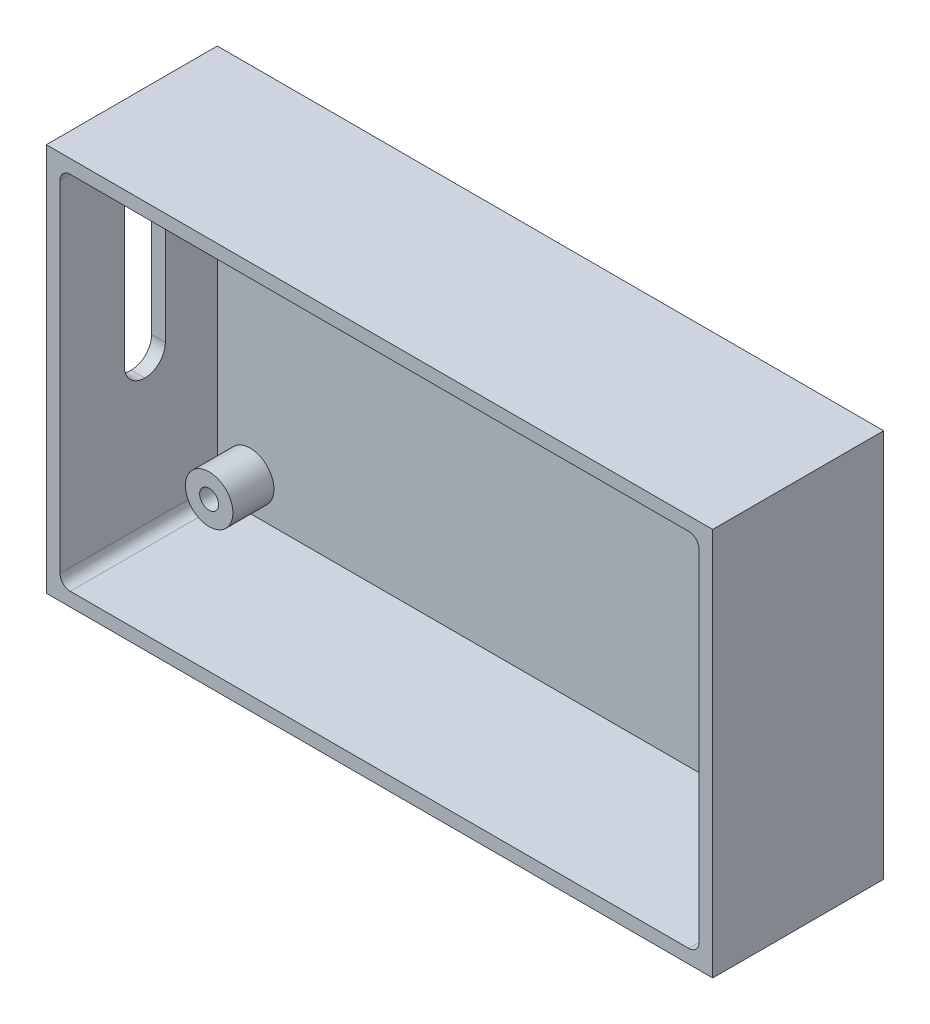
ISO-10303-21;
HEADER;
FILE_DESCRIPTION(('STEP AP214'),'2;1');
FILE_NAME('part.step','',(''),(''),'','','');
FILE_SCHEMA(('AUTOMOTIVE_DESIGN { 1 0 10303 214 1 1 1 1 }'));
ENDSEC;
DATA;
#1=APPLICATION_CONTEXT('core data for automotive mechanical design processes');
#2=APPLICATION_PROTOCOL_DEFINITION('international standard','automotive_design',2000,#1);
#3=PRODUCT_CONTEXT('',#1,'mechanical');
#4=PRODUCT('Part','Part','',(#3));
#5=PRODUCT_RELATED_PRODUCT_CATEGORY('part','',(#4));
#6=PRODUCT_DEFINITION_FORMATION('','',#4);
#7=PRODUCT_DEFINITION_CONTEXT('part definition',#1,'design');
#8=PRODUCT_DEFINITION('design','',#6,#7);
#9=PRODUCT_DEFINITION_SHAPE('','',#8);
#10=(LENGTH_UNIT() NAMED_UNIT(*) SI_UNIT(.MILLI.,.METRE.));
#11=(NAMED_UNIT(*) PLANE_ANGLE_UNIT() SI_UNIT($,.RADIAN.));
#12=(NAMED_UNIT(*) SI_UNIT($,.STERADIAN.) SOLID_ANGLE_UNIT());
#13=UNCERTAINTY_MEASURE_WITH_UNIT(LENGTH_MEASURE(1.E-05),#10,'distance_accuracy_value','');
#14=(GEOMETRIC_REPRESENTATION_CONTEXT(3) GLOBAL_UNCERTAINTY_ASSIGNED_CONTEXT((#13)) GLOBAL_UNIT_ASSIGNED_CONTEXT((#10,
#11,#12)) REPRESENTATION_CONTEXT('',''));
#15=CARTESIAN_POINT('',(0.,0.,0.));
#16=DIRECTION('',(0.,0.,1.));
#17=DIRECTION('',(1.,0.,0.));
#18=AXIS2_PLACEMENT_3D('',#15,#16,#17);
#19=CARTESIAN_POINT('',(3.81,3.81,0.));
#20=DIRECTION('',(0.,0.,-1.));
#21=DIRECTION('',(-1.,0.,0.));
#22=AXIS2_PLACEMENT_3D('',#19,#20,#21);
#23=PLANE('',#22);
#24=CARTESIAN_POINT('',(3.81,3.81,0.));
#25=DIRECTION('',(0.,0.,-1.));
#26=DIRECTION('',(-1.,0.,0.));
#27=AXIS2_PLACEMENT_3D('',#24,#25,#26);
#28=CIRCLE('',#27,3.47265625);
#29=CARTESIAN_POINT('',(0.33734375,3.81,0.));
#30=VERTEX_POINT('',#29);
#31=EDGE_CURVE('E249',#30,#30,#28,.T.);
#32=ORIENTED_EDGE('',*,*,#31,.F.);
#33=EDGE_LOOP('',(#32));
#34=FACE_BOUND('',#33,.T.);
#35=CARTESIAN_POINT('',(3.81,3.81,0.));
#36=DIRECTION('',(0.,0.,-1.));
#37=DIRECTION('',(-1.,0.,0.));
#38=AXIS2_PLACEMENT_3D('',#35,#36,#37);
#39=CIRCLE('',#38,1.3890625);
#40=CARTESIAN_POINT('',(2.4209375,3.81,0.));
#41=VERTEX_POINT('',#40);
#42=EDGE_CURVE('E245',#41,#41,#39,.T.);
#43=ORIENTED_EDGE('',*,*,#42,.T.);
#44=EDGE_LOOP('',(#43));
#45=FACE_BOUND('',#44,.T.);
#46=ADVANCED_FACE('F36',(#34,#45),#23,.F.);
#47=CARTESIAN_POINT('',(3.81,3.81,-6.));
#48=DIRECTION('',(0.,0.,1.));
#49=DIRECTION('',(1.,0.,0.));
#50=AXIS2_PLACEMENT_3D('',#47,#48,#49);
#51=CYLINDRICAL_SURFACE('',#50,3.47265625);
#52=CARTESIAN_POINT('',(3.81,3.81,-6.));
#53=DIRECTION('',(0.,0.,-1.));
#54=DIRECTION('',(-1.,0.,0.));
#55=AXIS2_PLACEMENT_3D('',#52,#53,#54);
#56=CIRCLE('',#55,3.47265625);
#57=CARTESIAN_POINT('',(0.33734375,3.81,-6.));
#58=VERTEX_POINT('',#57);
#59=EDGE_CURVE('E250',#58,#58,#56,.T.);
#60=ORIENTED_EDGE('',*,*,#59,.F.);
#61=EDGE_LOOP('',(#60));
#62=FACE_BOUND('',#61,.T.);
#63=ORIENTED_EDGE('',*,*,#31,.T.);
#64=EDGE_LOOP('',(#63));
#65=FACE_BOUND('',#64,.T.);
#66=ADVANCED_FACE('F443',(#62,#65),#51,.T.);
#67=CARTESIAN_POINT('',(3.81,3.81,-6.));
#68=DIRECTION('',(0.,0.,1.));
#69=DIRECTION('',(1.,0.,0.));
#70=AXIS2_PLACEMENT_3D('',#67,#68,#69);
#71=CYLINDRICAL_SURFACE('',#70,1.3890625);
#72=ORIENTED_EDGE('',*,*,#42,.F.);
#73=EDGE_LOOP('',(#72));
#74=FACE_BOUND('',#73,.T.);
#75=CARTESIAN_POINT('',(3.81,3.81,-8.));
#76=DIRECTION('',(0.,0.,-1.));
#77=DIRECTION('',(-1.,0.,0.));
#78=AXIS2_PLACEMENT_3D('',#75,#76,#77);
#79=CIRCLE('',#78,1.3890625);
#80=CARTESIAN_POINT('',(2.4209375,3.81,-8.));
#81=VERTEX_POINT('',#80);
#82=EDGE_CURVE('E357',#81,#81,#79,.F.);
#83=ORIENTED_EDGE('',*,*,#82,.F.);
#84=EDGE_LOOP('',(#83));
#85=FACE_BOUND('',#84,.T.);
#86=ADVANCED_FACE('F449',(#74,#85),#71,.F.);
#87=CARTESIAN_POINT('',(0.,0.,-6.));
#88=DIRECTION('',(0.,0.,-1.));
#89=DIRECTION('',(-1.,0.,0.));
#90=AXIS2_PLACEMENT_3D('',#87,#88,#89);
#91=PLANE('',#90);
#92=CARTESIAN_POINT('',(87.63,46.99,-6.));
#93=DIRECTION('',(0.,0.,-1.));
#94=DIRECTION('',(-1.,0.,0.));
#95=AXIS2_PLACEMENT_3D('',#92,#93,#94);
#96=CIRCLE('',#95,3.47265624999999);
#97=CARTESIAN_POINT('',(84.15734375,46.99,-6.));
#98=VERTEX_POINT('',#97);
#99=EDGE_CURVE('E254',#98,#98,#96,.F.);
#100=ORIENTED_EDGE('',*,*,#99,.F.);
#101=EDGE_LOOP('',(#100));
#102=FACE_BOUND('',#101,.T.);
#103=ORIENTED_EDGE('',*,*,#59,.T.);
#104=EDGE_LOOP('',(#103));
#105=FACE_BOUND('',#104,.T.);
#106=DIRECTION('',(0.,1.,0.));
#107=VECTOR('',#106,1.);
#108=CARTESIAN_POINT('',(-1.,-1.,-6.));
#109=LINE('',#108,#107);
#110=CARTESIAN_POINT('',(-1.,0.5,-6.));
#111=VERTEX_POINT('',#110);
#112=CARTESIAN_POINT('',(-1.,50.3,-6.));
#113=VERTEX_POINT('',#112);
#114=EDGE_CURVE('E237',#111,#113,#109,.T.);
#115=ORIENTED_EDGE('',*,*,#114,.F.);
#116=CARTESIAN_POINT('',(0.5,0.5,-6.));
#117=DIRECTION('',(0.,0.,-1.));
#118=DIRECTION('',(-1.,0.,0.));
#119=AXIS2_PLACEMENT_3D('',#116,#117,#118);
#120=CIRCLE('',#119,1.5);
#121=CARTESIAN_POINT('',(0.5,-1.,-6.));
#122=VERTEX_POINT('',#121);
#123=EDGE_CURVE('E276',#111,#122,#120,.F.);
#124=ORIENTED_EDGE('',*,*,#123,.T.);
#125=DIRECTION('',(-1.,0.,0.));
#126=VECTOR('',#125,1.);
#127=CARTESIAN_POINT('',(-1.,-1.,-6.));
#128=LINE('',#127,#126);
#129=CARTESIAN_POINT('',(90.94,-1.,-6.));
#130=VERTEX_POINT('',#129);
#131=EDGE_CURVE('E233',#130,#122,#128,.T.);
#132=ORIENTED_EDGE('',*,*,#131,.F.);
#133=CARTESIAN_POINT('',(90.94,0.5,-6.));
#134=DIRECTION('',(0.,0.,-1.));
#135=DIRECTION('',(-1.,0.,0.));
#136=AXIS2_PLACEMENT_3D('',#133,#134,#135);
#137=CIRCLE('',#136,1.5);
#138=CARTESIAN_POINT('',(92.44,0.5,-6.));
#139=VERTEX_POINT('',#138);
#140=EDGE_CURVE('E274',#130,#139,#137,.F.);
#141=ORIENTED_EDGE('',*,*,#140,.T.);
#142=DIRECTION('',(0.,-1.,0.));
#143=VECTOR('',#142,1.);
#144=CARTESIAN_POINT('',(92.44,-1.,-6.));
#145=LINE('',#144,#143);
#146=CARTESIAN_POINT('',(92.44,50.3,-6.));
#147=VERTEX_POINT('',#146);
#148=EDGE_CURVE('E229',#147,#139,#145,.T.);
#149=ORIENTED_EDGE('',*,*,#148,.F.);
#150=CARTESIAN_POINT('',(90.94,50.3,-6.));
#151=DIRECTION('',(0.,0.,-1.));
#152=DIRECTION('',(-1.,0.,0.));
#153=AXIS2_PLACEMENT_3D('',#150,#151,#152);
#154=CIRCLE('',#153,1.5);
#155=CARTESIAN_POINT('',(90.94,51.8,-6.));
#156=VERTEX_POINT('',#155);
#157=EDGE_CURVE('E271',#147,#156,#154,.F.);
#158=ORIENTED_EDGE('',*,*,#157,.T.);
#159=DIRECTION('',(1.,0.,0.));
#160=VECTOR('',#159,1.);
#161=CARTESIAN_POINT('',(-1.,51.8,-6.));
#162=LINE('',#161,#160);
#163=CARTESIAN_POINT('',(0.5,51.8,-6.));
#164=VERTEX_POINT('',#163);
#165=EDGE_CURVE('E241',#164,#156,#162,.T.);
#166=ORIENTED_EDGE('',*,*,#165,.F.);
#167=CARTESIAN_POINT('',(0.5,50.3,-6.));
#168=DIRECTION('',(0.,0.,-1.));
#169=DIRECTION('',(-1.,0.,0.));
#170=AXIS2_PLACEMENT_3D('',#167,#168,#169);
#171=CIRCLE('',#170,1.5);
#172=EDGE_CURVE('E268',#164,#113,#171,.F.);
#173=ORIENTED_EDGE('',*,*,#172,.T.);
#174=EDGE_LOOP('',(#115,#124,#132,#141,#149,#158,#166,#173));
#175=FACE_BOUND('',#174,.T.);
#176=ADVANCED_FACE('F410',(#102,#105,#175),#91,.F.);
#177=CARTESIAN_POINT('',(87.63,46.99,0.));
#178=DIRECTION('',(0.,0.,-1.));
#179=DIRECTION('',(-1.,0.,0.));
#180=AXIS2_PLACEMENT_3D('',#177,#178,#179);
#181=PLANE('',#180);
#182=CARTESIAN_POINT('',(87.63,46.99,0.));
#183=DIRECTION('',(0.,0.,-1.));
#184=DIRECTION('',(-1.,0.,0.));
#185=AXIS2_PLACEMENT_3D('',#182,#183,#184);
#186=CIRCLE('',#185,3.47265624999999);
#187=CARTESIAN_POINT('',(84.15734375,46.99,0.));
#188=VERTEX_POINT('',#187);
#189=EDGE_CURVE('E225',#188,#188,#186,.T.);
#190=ORIENTED_EDGE('',*,*,#189,.F.);
#191=EDGE_LOOP('',(#190));
#192=FACE_BOUND('',#191,.T.);
#193=CARTESIAN_POINT('',(87.63,46.99,0.));
#194=DIRECTION('',(0.,0.,-1.));
#195=DIRECTION('',(-1.,0.,0.));
#196=AXIS2_PLACEMENT_3D('',#193,#194,#195);
#197=CIRCLE('',#196,1.38906249999999);
#198=CARTESIAN_POINT('',(86.2409375,46.99,0.));
#199=VERTEX_POINT('',#198);
#200=EDGE_CURVE('E216',#199,#199,#197,.T.);
#201=ORIENTED_EDGE('',*,*,#200,.T.);
#202=EDGE_LOOP('',(#201));
#203=FACE_BOUND('',#202,.T.);
#204=ADVANCED_FACE('F513',(#192,#203),#181,.F.);
#205=CARTESIAN_POINT('',(87.63,46.99,-6.));
#206=DIRECTION('',(0.,0.,1.));
#207=DIRECTION('',(1.,0.,0.));
#208=AXIS2_PLACEMENT_3D('',#205,#206,#207);
#209=CYLINDRICAL_SURFACE('',#208,3.47265624999999);
#210=ORIENTED_EDGE('',*,*,#99,.T.);
#211=EDGE_LOOP('',(#210));
#212=FACE_BOUND('',#211,.T.);
#213=ORIENTED_EDGE('',*,*,#189,.T.);
#214=EDGE_LOOP('',(#213));
#215=FACE_BOUND('',#214,.T.);
#216=ADVANCED_FACE('F511',(#212,#215),#209,.T.);
#217=CARTESIAN_POINT('',(87.63,46.99,-6.));
#218=DIRECTION('',(0.,0.,1.));
#219=DIRECTION('',(1.,0.,0.));
#220=AXIS2_PLACEMENT_3D('',#217,#218,#219);
#221=CYLINDRICAL_SURFACE('',#220,1.38906249999999);
#222=ORIENTED_EDGE('',*,*,#200,.F.);
#223=EDGE_LOOP('',(#222));
#224=FACE_BOUND('',#223,.T.);
#225=CARTESIAN_POINT('',(87.63,46.99,-8.));
#226=DIRECTION('',(0.,0.,-1.));
#227=DIRECTION('',(-1.,0.,0.));
#228=AXIS2_PLACEMENT_3D('',#225,#226,#227);
#229=CIRCLE('',#228,1.38906249999999);
#230=CARTESIAN_POINT('',(86.2409375,46.99,-8.));
#231=VERTEX_POINT('',#230);
#232=EDGE_CURVE('E362',#231,#231,#229,.F.);
#233=ORIENTED_EDGE('',*,*,#232,.F.);
#234=EDGE_LOOP('',(#233));
#235=FACE_BOUND('',#234,.T.);
#236=ADVANCED_FACE('F439',(#224,#235),#221,.F.);
#237=CARTESIAN_POINT('',(-1.,-1.,17.));
#238=DIRECTION('',(-1.,0.,0.));
#239=DIRECTION('',(0.,0.,1.));
#240=AXIS2_PLACEMENT_3D('',#237,#238,#239);
#241=PLANE('',#240);
#242=DIRECTION('',(0.,-1.,0.));
#243=VECTOR('',#242,1.);
#244=CARTESIAN_POINT('',(-1.,19.05,7.6));
#245=LINE('',#244,#243);
#246=CARTESIAN_POINT('',(-1.,46.53,7.6));
#247=VERTEX_POINT('',#246);
#248=CARTESIAN_POINT('',(-1.,22.05,7.6));
#249=VERTEX_POINT('',#248);
#250=EDGE_CURVE('E375',#247,#249,#245,.T.);
#251=ORIENTED_EDGE('',*,*,#250,.F.);
#252=CARTESIAN_POINT('',(-1.,46.53,4.6));
#253=DIRECTION('',(-1.,0.,0.));
#254=DIRECTION('',(0.,0.,1.));
#255=AXIS2_PLACEMENT_3D('',#252,#253,#254);
#256=CIRCLE('',#255,3.);
#257=CARTESIAN_POINT('',(-1.,49.53,4.6));
#258=VERTEX_POINT('',#257);
#259=EDGE_CURVE('E11',#247,#258,#256,.T.);
#260=ORIENTED_EDGE('',*,*,#259,.T.);
#261=CARTESIAN_POINT('',(-1.,46.53,4.6));
#262=DIRECTION('',(-1.,0.,0.));
#263=DIRECTION('',(0.,0.,1.));
#264=AXIS2_PLACEMENT_3D('',#261,#262,#263);
#265=CIRCLE('',#264,3.);
#266=CARTESIAN_POINT('',(-1.,46.53,1.6));
#267=VERTEX_POINT('',#266);
#268=EDGE_CURVE('E340',#258,#267,#265,.T.);
#269=ORIENTED_EDGE('',*,*,#268,.T.);
#270=DIRECTION('',(0.,1.,0.));
#271=VECTOR('',#270,1.);
#272=CARTESIAN_POINT('',(-1.,49.53,1.6));
#273=LINE('',#272,#271);
#274=CARTESIAN_POINT('',(-1.,22.05,1.6));
#275=VERTEX_POINT('',#274);
#276=EDGE_CURVE('E371',#275,#267,#273,.T.);
#277=ORIENTED_EDGE('',*,*,#276,.F.);
#278=CARTESIAN_POINT('',(-1.,22.05,4.6));
#279=DIRECTION('',(-1.,0.,0.));
#280=DIRECTION('',(0.,0.,1.));
#281=AXIS2_PLACEMENT_3D('',#278,#279,#280);
#282=CIRCLE('',#281,3.);
#283=CARTESIAN_POINT('',(-1.,19.05,4.6));
#284=VERTEX_POINT('',#283);
#285=EDGE_CURVE('E329',#275,#284,#282,.T.);
#286=ORIENTED_EDGE('',*,*,#285,.T.);
#287=CARTESIAN_POINT('',(-1.,22.05,4.6));
#288=DIRECTION('',(-1.,0.,0.));
#289=DIRECTION('',(0.,0.,1.));
#290=AXIS2_PLACEMENT_3D('',#287,#288,#289);
#291=CIRCLE('',#290,3.);
#292=EDGE_CURVE('E335',#284,#249,#291,.T.);
#293=ORIENTED_EDGE('',*,*,#292,.T.);
#294=EDGE_LOOP('',(#251,#260,#269,#277,#286,#293));
#295=FACE_BOUND('',#294,.T.);
#296=DIRECTION('',(0.,1.,0.));
#297=VECTOR('',#296,1.);
#298=CARTESIAN_POINT('',(-1.,-1.,17.));
#299=LINE('',#298,#297);
#300=CARTESIAN_POINT('',(-1.,0.5,17.));
#301=VERTEX_POINT('',#300);
#302=CARTESIAN_POINT('',(-1.,50.3,17.));
#303=VERTEX_POINT('',#302);
#304=EDGE_CURVE('E382',#301,#303,#299,.T.);
#305=ORIENTED_EDGE('',*,*,#304,.F.);
#306=DIRECTION('',(0.,0.,-1.));
#307=VECTOR('',#306,1.);
#308=CARTESIAN_POINT('',(-1.,0.5,-6.));
#309=LINE('',#308,#307);
#310=EDGE_CURVE('E264',#301,#111,#309,.T.);
#311=ORIENTED_EDGE('',*,*,#310,.T.);
#312=ORIENTED_EDGE('',*,*,#114,.T.);
#313=DIRECTION('',(0.,0.,-1.));
#314=VECTOR('',#313,1.);
#315=CARTESIAN_POINT('',(-1.,50.3,17.));
#316=LINE('',#315,#314);
#317=EDGE_CURVE('E261',#113,#303,#316,.F.);
#318=ORIENTED_EDGE('',*,*,#317,.T.);
#319=EDGE_LOOP('',(#305,#311,#312,#318));
#320=FACE_BOUND('',#319,.T.);
#321=ADVANCED_FACE('F407',(#295,#320),#241,.F.);
#322=CARTESIAN_POINT('',(92.44,-1.,17.));
#323=DIRECTION('',(0.,-1.,0.));
#324=DIRECTION('',(0.,0.,-1.));
#325=AXIS2_PLACEMENT_3D('',#322,#323,#324);
#326=PLANE('',#325);
#327=ORIENTED_EDGE('',*,*,#131,.T.);
#328=DIRECTION('',(0.,0.,-1.));
#329=VECTOR('',#328,1.);
#330=CARTESIAN_POINT('',(0.5,-1.,17.));
#331=LINE('',#330,#329);
#332=CARTESIAN_POINT('',(0.500000000000028,-1.,17.));
#333=VERTEX_POINT('',#332);
#334=EDGE_CURVE('E283',#122,#333,#331,.F.);
#335=ORIENTED_EDGE('',*,*,#334,.T.);
#336=DIRECTION('',(-1.,0.,0.));
#337=VECTOR('',#336,1.);
#338=CARTESIAN_POINT('',(92.44,-1.,17.));
#339=LINE('',#338,#337);
#340=CARTESIAN_POINT('',(90.94,-1.,17.));
#341=VERTEX_POINT('',#340);
#342=EDGE_CURVE('E200',#341,#333,#339,.T.);
#343=ORIENTED_EDGE('',*,*,#342,.F.);
#344=DIRECTION('',(0.,0.,-1.));
#345=VECTOR('',#344,1.);
#346=CARTESIAN_POINT('',(90.94,-1.,-6.));
#347=LINE('',#346,#345);
#348=EDGE_CURVE('E279',#341,#130,#347,.T.);
#349=ORIENTED_EDGE('',*,*,#348,.T.);
#350=EDGE_LOOP('',(#327,#335,#343,#349));
#351=FACE_BOUND('',#350,.T.);
#352=ADVANCED_FACE('F431',(#351),#326,.F.);
#353=CARTESIAN_POINT('',(92.44,51.8,17.));
#354=DIRECTION('',(1.,0.,0.));
#355=DIRECTION('',(0.,0.,-1.));
#356=AXIS2_PLACEMENT_3D('',#353,#354,#355);
#357=PLANE('',#356);
#358=ORIENTED_EDGE('',*,*,#148,.T.);
#359=DIRECTION('',(0.,0.,-1.));
#360=VECTOR('',#359,1.);
#361=CARTESIAN_POINT('',(92.44,0.5,17.));
#362=LINE('',#361,#360);
#363=CARTESIAN_POINT('',(92.44,0.5,17.));
#364=VERTEX_POINT('',#363);
#365=EDGE_CURVE('E290',#139,#364,#362,.F.);
#366=ORIENTED_EDGE('',*,*,#365,.T.);
#367=DIRECTION('',(0.,-1.,0.));
#368=VECTOR('',#367,1.);
#369=CARTESIAN_POINT('',(92.44,51.8,17.));
#370=LINE('',#369,#368);
#371=CARTESIAN_POINT('',(92.44,50.3,17.));
#372=VERTEX_POINT('',#371);
#373=EDGE_CURVE('E388',#372,#364,#370,.T.);
#374=ORIENTED_EDGE('',*,*,#373,.F.);
#375=DIRECTION('',(0.,0.,-1.));
#376=VECTOR('',#375,1.);
#377=CARTESIAN_POINT('',(92.44,50.3,-6.));
#378=LINE('',#377,#376);
#379=EDGE_CURVE('E286',#372,#147,#378,.T.);
#380=ORIENTED_EDGE('',*,*,#379,.T.);
#381=EDGE_LOOP('',(#358,#366,#374,#380));
#382=FACE_BOUND('',#381,.T.);
#383=ADVANCED_FACE('F427',(#382),#357,.F.);
#384=CARTESIAN_POINT('',(-1.,51.8,17.));
#385=DIRECTION('',(0.,1.,0.));
#386=DIRECTION('',(0.,0.,1.));
#387=AXIS2_PLACEMENT_3D('',#384,#385,#386);
#388=PLANE('',#387);
#389=ORIENTED_EDGE('',*,*,#165,.T.);
#390=DIRECTION('',(0.,0.,-1.));
#391=VECTOR('',#390,1.);
#392=CARTESIAN_POINT('',(90.94,51.8,17.));
#393=LINE('',#392,#391);
#394=CARTESIAN_POINT('',(90.94,51.8,17.));
#395=VERTEX_POINT('',#394);
#396=EDGE_CURVE('E297',#156,#395,#393,.F.);
#397=ORIENTED_EDGE('',*,*,#396,.T.);
#398=DIRECTION('',(1.,0.,0.));
#399=VECTOR('',#398,1.);
#400=CARTESIAN_POINT('',(-1.,51.8,17.));
#401=LINE('',#400,#399);
#402=CARTESIAN_POINT('',(0.5,51.8,17.));
#403=VERTEX_POINT('',#402);
#404=EDGE_CURVE('E385',#403,#395,#401,.T.);
#405=ORIENTED_EDGE('',*,*,#404,.F.);
#406=DIRECTION('',(0.,0.,-1.));
#407=VECTOR('',#406,1.);
#408=CARTESIAN_POINT('',(0.5,51.8,-6.));
#409=LINE('',#408,#407);
#410=EDGE_CURVE('E293',#403,#164,#409,.T.);
#411=ORIENTED_EDGE('',*,*,#410,.T.);
#412=EDGE_LOOP('',(#389,#397,#405,#411));
#413=FACE_BOUND('',#412,.T.);
#414=ADVANCED_FACE('F419',(#413),#388,.F.);
#415=CARTESIAN_POINT('',(94.44,-3.,17.));
#416=DIRECTION('',(1.,0.,0.));
#417=DIRECTION('',(0.,0.,-1.));
#418=AXIS2_PLACEMENT_3D('',#415,#416,#417);
#419=PLANE('',#418);
#420=DIRECTION('',(0.,-1.,0.));
#421=VECTOR('',#420,1.);
#422=CARTESIAN_POINT('',(94.44,-3.,-8.));
#423=LINE('',#422,#421);
#424=CARTESIAN_POINT('',(94.44,53.8,-8.));
#425=VERTEX_POINT('',#424);
#426=CARTESIAN_POINT('',(94.44,-3.,-8.));
#427=VERTEX_POINT('',#426);
#428=EDGE_CURVE('E207',#425,#427,#423,.T.);
#429=ORIENTED_EDGE('',*,*,#428,.F.);
#430=DIRECTION('',(0.,0.,-1.));
#431=VECTOR('',#430,1.);
#432=CARTESIAN_POINT('',(94.44,53.8,17.));
#433=LINE('',#432,#431);
#434=CARTESIAN_POINT('',(94.44,53.8,17.));
#435=VERTEX_POINT('',#434);
#436=EDGE_CURVE('E189',#435,#425,#433,.T.);
#437=ORIENTED_EDGE('',*,*,#436,.F.);
#438=DIRECTION('',(0.,-1.,0.));
#439=VECTOR('',#438,1.);
#440=CARTESIAN_POINT('',(94.44,-3.,17.));
#441=LINE('',#440,#439);
#442=CARTESIAN_POINT('',(94.44,-3.,17.));
#443=VERTEX_POINT('',#442);
#444=EDGE_CURVE('E182',#435,#443,#441,.T.);
#445=ORIENTED_EDGE('',*,*,#444,.T.);
#446=DIRECTION('',(0.,0.,-1.));
#447=VECTOR('',#446,1.);
#448=CARTESIAN_POINT('',(94.44,-3.,17.));
#449=LINE('',#448,#447);
#450=EDGE_CURVE('E163',#443,#427,#449,.T.);
#451=ORIENTED_EDGE('',*,*,#450,.T.);
#452=EDGE_LOOP('',(#429,#437,#445,#451));
#453=FACE_BOUND('',#452,.T.);
#454=ADVANCED_FACE('F188',(#453),#419,.T.);
#455=CARTESIAN_POINT('',(-3.00000000000001,53.8,17.));
#456=DIRECTION('',(0.,1.,0.));
#457=DIRECTION('',(0.,0.,1.));
#458=AXIS2_PLACEMENT_3D('',#455,#456,#457);
#459=PLANE('',#458);
#460=DIRECTION('',(1.,0.,0.));
#461=VECTOR('',#460,1.);
#462=CARTESIAN_POINT('',(-3.00000000000001,53.8,-8.));
#463=LINE('',#462,#461);
#464=CARTESIAN_POINT('',(-3.00000000000001,53.8,-8.));
#465=VERTEX_POINT('',#464);
#466=EDGE_CURVE('E191',#465,#425,#463,.T.);
#467=ORIENTED_EDGE('',*,*,#466,.F.);
#468=DIRECTION('',(0.,0.,-1.));
#469=VECTOR('',#468,1.);
#470=CARTESIAN_POINT('',(-3.00000000000001,53.8,17.));
#471=LINE('',#470,#469);
#472=CARTESIAN_POINT('',(-3.00000000000001,53.8,17.));
#473=VERTEX_POINT('',#472);
#474=EDGE_CURVE('E217',#473,#465,#471,.T.);
#475=ORIENTED_EDGE('',*,*,#474,.F.);
#476=DIRECTION('',(1.,0.,0.));
#477=VECTOR('',#476,1.);
#478=CARTESIAN_POINT('',(-3.00000000000001,53.8,17.));
#479=LINE('',#478,#477);
#480=EDGE_CURVE('E175',#473,#435,#479,.T.);
#481=ORIENTED_EDGE('',*,*,#480,.T.);
#482=ORIENTED_EDGE('',*,*,#436,.T.);
#483=EDGE_LOOP('',(#467,#475,#481,#482));
#484=FACE_BOUND('',#483,.T.);
#485=ADVANCED_FACE('F493',(#484),#459,.T.);
#486=CARTESIAN_POINT('',(-3.00000000000001,-3.,17.));
#487=DIRECTION('',(-1.,0.,0.));
#488=DIRECTION('',(0.,0.,1.));
#489=AXIS2_PLACEMENT_3D('',#486,#487,#488);
#490=PLANE('',#489);
#491=CARTESIAN_POINT('',(-3.,46.53,4.6));
#492=DIRECTION('',(-1.,0.,0.));
#493=DIRECTION('',(0.,0.,1.));
#494=AXIS2_PLACEMENT_3D('',#491,#492,#493);
#495=CIRCLE('',#494,3.);
#496=CARTESIAN_POINT('',(-3.00000000000001,46.53,1.6));
#497=VERTEX_POINT('',#496);
#498=CARTESIAN_POINT('',(-3.00000000000001,49.53,4.6));
#499=VERTEX_POINT('',#498);
#500=EDGE_CURVE('E60',#497,#499,#495,.F.);
#501=ORIENTED_EDGE('',*,*,#500,.T.);
#502=CARTESIAN_POINT('',(-3.,46.53,4.6));
#503=DIRECTION('',(-1.,0.,0.));
#504=DIRECTION('',(0.,0.,1.));
#505=AXIS2_PLACEMENT_3D('',#502,#503,#504);
#506=CIRCLE('',#505,3.);
#507=CARTESIAN_POINT('',(-3.00000000000001,46.53,7.6));
#508=VERTEX_POINT('',#507);
#509=EDGE_CURVE('E46',#499,#508,#506,.F.);
#510=ORIENTED_EDGE('',*,*,#509,.T.);
#511=DIRECTION('',(0.,1.,0.));
#512=VECTOR('',#511,1.);
#513=CARTESIAN_POINT('',(-3.00000000000001,19.05,7.6));
#514=LINE('',#513,#512);
#515=CARTESIAN_POINT('',(-3.00000000000001,22.05,7.6));
#516=VERTEX_POINT('',#515);
#517=EDGE_CURVE('E353',#516,#508,#514,.T.);
#518=ORIENTED_EDGE('',*,*,#517,.F.);
#519=CARTESIAN_POINT('',(-3.,22.05,4.6));
#520=DIRECTION('',(-1.,0.,0.));
#521=DIRECTION('',(0.,0.,1.));
#522=AXIS2_PLACEMENT_3D('',#519,#520,#521);
#523=CIRCLE('',#522,3.);
#524=CARTESIAN_POINT('',(-3.00000000000001,19.05,4.6));
#525=VERTEX_POINT('',#524);
#526=EDGE_CURVE('E332',#516,#525,#523,.F.);
#527=ORIENTED_EDGE('',*,*,#526,.T.);
#528=CARTESIAN_POINT('',(-3.,22.05,4.6));
#529=DIRECTION('',(-1.,0.,0.));
#530=DIRECTION('',(0.,0.,1.));
#531=AXIS2_PLACEMENT_3D('',#528,#529,#530);
#532=CIRCLE('',#531,3.);
#533=CARTESIAN_POINT('',(-3.00000000000001,22.05,1.6));
#534=VERTEX_POINT('',#533);
#535=EDGE_CURVE('E326',#525,#534,#532,.F.);
#536=ORIENTED_EDGE('',*,*,#535,.T.);
#537=DIRECTION('',(0.,-1.,0.));
#538=VECTOR('',#537,1.);
#539=CARTESIAN_POINT('',(-3.00000000000001,49.53,1.6));
#540=LINE('',#539,#538);
#541=EDGE_CURVE('E347',#497,#534,#540,.T.);
#542=ORIENTED_EDGE('',*,*,#541,.F.);
#543=EDGE_LOOP('',(#501,#510,#518,#527,#536,#542));
#544=FACE_BOUND('',#543,.T.);
#545=DIRECTION('',(0.,1.,0.));
#546=VECTOR('',#545,1.);
#547=CARTESIAN_POINT('',(-3.00000000000001,-3.,-8.));
#548=LINE('',#547,#546);
#549=CARTESIAN_POINT('',(-3.00000000000001,-3.,-8.));
#550=VERTEX_POINT('',#549);
#551=EDGE_CURVE('E197',#550,#465,#548,.T.);
#552=ORIENTED_EDGE('',*,*,#551,.F.);
#553=DIRECTION('',(0.,0.,-1.));
#554=VECTOR('',#553,1.);
#555=CARTESIAN_POINT('',(-3.00000000000001,-3.,17.));
#556=LINE('',#555,#554);
#557=CARTESIAN_POINT('',(-3.00000000000001,-3.,17.));
#558=VERTEX_POINT('',#557);
#559=EDGE_CURVE('E174',#558,#550,#556,.T.);
#560=ORIENTED_EDGE('',*,*,#559,.F.);
#561=DIRECTION('',(0.,1.,0.));
#562=VECTOR('',#561,1.);
#563=CARTESIAN_POINT('',(-3.00000000000001,-3.,17.));
#564=LINE('',#563,#562);
#565=EDGE_CURVE('E185',#558,#473,#564,.T.);
#566=ORIENTED_EDGE('',*,*,#565,.T.);
#567=ORIENTED_EDGE('',*,*,#474,.T.);
#568=EDGE_LOOP('',(#552,#560,#566,#567));
#569=FACE_BOUND('',#568,.T.);
#570=ADVANCED_FACE('F490',(#544,#569),#490,.T.);
#571=CARTESIAN_POINT('',(-3.00000000000001,-3.,17.));
#572=DIRECTION('',(0.,-1.,0.));
#573=DIRECTION('',(0.,0.,-1.));
#574=AXIS2_PLACEMENT_3D('',#571,#572,#573);
#575=PLANE('',#574);
#576=DIRECTION('',(-1.,0.,0.));
#577=VECTOR('',#576,1.);
#578=CARTESIAN_POINT('',(-3.00000000000001,-3.,-8.));
#579=LINE('',#578,#577);
#580=EDGE_CURVE('E168',#427,#550,#579,.T.);
#581=ORIENTED_EDGE('',*,*,#580,.F.);
#582=ORIENTED_EDGE('',*,*,#450,.F.);
#583=DIRECTION('',(-1.,0.,0.));
#584=VECTOR('',#583,1.);
#585=CARTESIAN_POINT('',(-3.00000000000001,-3.,17.));
#586=LINE('',#585,#584);
#587=EDGE_CURVE('E166',#443,#558,#586,.T.);
#588=ORIENTED_EDGE('',*,*,#587,.T.);
#589=ORIENTED_EDGE('',*,*,#559,.T.);
#590=EDGE_LOOP('',(#581,#582,#588,#589));
#591=FACE_BOUND('',#590,.T.);
#592=ADVANCED_FACE('F165',(#591),#575,.T.);
#593=CARTESIAN_POINT('',(0.,0.,17.));
#594=DIRECTION('',(0.,0.,-1.));
#595=DIRECTION('',(-1.,0.,0.));
#596=AXIS2_PLACEMENT_3D('',#593,#594,#595);
#597=PLANE('',#596);
#598=ORIENTED_EDGE('',*,*,#373,.T.);
#599=CARTESIAN_POINT('',(90.94,0.5,17.));
#600=DIRECTION('',(0.,0.,-1.));
#601=DIRECTION('',(-1.,0.,0.));
#602=AXIS2_PLACEMENT_3D('',#599,#600,#601);
#603=CIRCLE('',#602,1.5);
#604=EDGE_CURVE('E303',#364,#341,#603,.T.);
#605=ORIENTED_EDGE('',*,*,#604,.T.);
#606=ORIENTED_EDGE('',*,*,#342,.T.);
#607=CARTESIAN_POINT('',(0.5,0.5,17.));
#608=DIRECTION('',(0.,0.,-1.));
#609=DIRECTION('',(-1.,0.,0.));
#610=AXIS2_PLACEMENT_3D('',#607,#608,#609);
#611=CIRCLE('',#610,1.5);
#612=EDGE_CURVE('E300',#333,#301,#611,.T.);
#613=ORIENTED_EDGE('',*,*,#612,.T.);
#614=ORIENTED_EDGE('',*,*,#304,.T.);
#615=CARTESIAN_POINT('',(0.5,50.3,17.));
#616=DIRECTION('',(0.,0.,-1.));
#617=DIRECTION('',(-1.,0.,0.));
#618=AXIS2_PLACEMENT_3D('',#615,#616,#617);
#619=CIRCLE('',#618,1.5);
#620=EDGE_CURVE('E309',#303,#403,#619,.T.);
#621=ORIENTED_EDGE('',*,*,#620,.T.);
#622=ORIENTED_EDGE('',*,*,#404,.T.);
#623=CARTESIAN_POINT('',(90.94,50.3,17.));
#624=DIRECTION('',(0.,0.,-1.));
#625=DIRECTION('',(-1.,0.,0.));
#626=AXIS2_PLACEMENT_3D('',#623,#624,#625);
#627=CIRCLE('',#626,1.5);
#628=EDGE_CURVE('E306',#395,#372,#627,.T.);
#629=ORIENTED_EDGE('',*,*,#628,.T.);
#630=EDGE_LOOP('',(#598,#605,#606,#613,#614,#621,#622,#629));
#631=FACE_BOUND('',#630,.T.);
#632=ORIENTED_EDGE('',*,*,#444,.F.);
#633=ORIENTED_EDGE('',*,*,#480,.F.);
#634=ORIENTED_EDGE('',*,*,#565,.F.);
#635=ORIENTED_EDGE('',*,*,#587,.F.);
#636=EDGE_LOOP('',(#632,#633,#634,#635));
#637=FACE_BOUND('',#636,.T.);
#638=ADVANCED_FACE('F180',(#631,#637),#597,.F.);
#639=CARTESIAN_POINT('',(0.,0.,-8.));
#640=DIRECTION('',(0.,0.,-1.));
#641=DIRECTION('',(-1.,0.,0.));
#642=AXIS2_PLACEMENT_3D('',#639,#640,#641);
#643=PLANE('',#642);
#644=ORIENTED_EDGE('',*,*,#82,.T.);
#645=EDGE_LOOP('',(#644));
#646=FACE_BOUND('',#645,.T.);
#647=ORIENTED_EDGE('',*,*,#232,.T.);
#648=EDGE_LOOP('',(#647));
#649=FACE_BOUND('',#648,.T.);
#650=ORIENTED_EDGE('',*,*,#428,.T.);
#651=ORIENTED_EDGE('',*,*,#580,.T.);
#652=ORIENTED_EDGE('',*,*,#551,.T.);
#653=ORIENTED_EDGE('',*,*,#466,.T.);
#654=EDGE_LOOP('',(#650,#651,#652,#653));
#655=FACE_BOUND('',#654,.T.);
#656=ADVANCED_FACE('F459',(#646,#649,#655),#643,.T.);
#657=CARTESIAN_POINT('',(0.5,0.5,17.));
#658=DIRECTION('',(0.,0.,1.));
#659=DIRECTION('',(1.,0.,0.));
#660=AXIS2_PLACEMENT_3D('',#657,#658,#659);
#661=CYLINDRICAL_SURFACE('',#660,1.5);
#662=ORIENTED_EDGE('',*,*,#612,.F.);
#663=ORIENTED_EDGE('',*,*,#334,.F.);
#664=ORIENTED_EDGE('',*,*,#123,.F.);
#665=ORIENTED_EDGE('',*,*,#310,.F.);
#666=EDGE_LOOP('',(#662,#663,#664,#665));
#667=FACE_BOUND('',#666,.T.);
#668=ADVANCED_FACE('F404',(#667),#661,.F.);
#669=CARTESIAN_POINT('',(90.94,0.5,17.));
#670=DIRECTION('',(0.,0.,1.));
#671=DIRECTION('',(1.,0.,0.));
#672=AXIS2_PLACEMENT_3D('',#669,#670,#671);
#673=CYLINDRICAL_SURFACE('',#672,1.5);
#674=ORIENTED_EDGE('',*,*,#604,.F.);
#675=ORIENTED_EDGE('',*,*,#365,.F.);
#676=ORIENTED_EDGE('',*,*,#140,.F.);
#677=ORIENTED_EDGE('',*,*,#348,.F.);
#678=EDGE_LOOP('',(#674,#675,#676,#677));
#679=FACE_BOUND('',#678,.T.);
#680=ADVANCED_FACE('F430',(#679),#673,.F.);
#681=CARTESIAN_POINT('',(90.94,50.3,17.));
#682=DIRECTION('',(0.,0.,1.));
#683=DIRECTION('',(1.,0.,0.));
#684=AXIS2_PLACEMENT_3D('',#681,#682,#683);
#685=CYLINDRICAL_SURFACE('',#684,1.5);
#686=ORIENTED_EDGE('',*,*,#628,.F.);
#687=ORIENTED_EDGE('',*,*,#396,.F.);
#688=ORIENTED_EDGE('',*,*,#157,.F.);
#689=ORIENTED_EDGE('',*,*,#379,.F.);
#690=EDGE_LOOP('',(#686,#687,#688,#689));
#691=FACE_BOUND('',#690,.T.);
#692=ADVANCED_FACE('F424',(#691),#685,.F.);
#693=CARTESIAN_POINT('',(0.5,50.3,17.));
#694=DIRECTION('',(0.,0.,1.));
#695=DIRECTION('',(1.,0.,0.));
#696=AXIS2_PLACEMENT_3D('',#693,#694,#695);
#697=CYLINDRICAL_SURFACE('',#696,1.5);
#698=ORIENTED_EDGE('',*,*,#620,.F.);
#699=ORIENTED_EDGE('',*,*,#317,.F.);
#700=ORIENTED_EDGE('',*,*,#172,.F.);
#701=ORIENTED_EDGE('',*,*,#410,.F.);
#702=EDGE_LOOP('',(#698,#699,#700,#701));
#703=FACE_BOUND('',#702,.T.);
#704=ADVANCED_FACE('F416',(#703),#697,.F.);
#705=CARTESIAN_POINT('',(94.441,19.05,7.6));
#706=DIRECTION('',(0.,0.,1.));
#707=DIRECTION('',(1.,0.,0.));
#708=AXIS2_PLACEMENT_3D('',#705,#706,#707);
#709=PLANE('',#708);
#710=ORIENTED_EDGE('',*,*,#250,.T.);
#711=DIRECTION('',(-1.,0.,0.));
#712=VECTOR('',#711,1.);
#713=CARTESIAN_POINT('',(-3.,22.05,7.6));
#714=LINE('',#713,#712);
#715=EDGE_CURVE('E323',#249,#516,#714,.T.);
#716=ORIENTED_EDGE('',*,*,#715,.T.);
#717=ORIENTED_EDGE('',*,*,#517,.T.);
#718=DIRECTION('',(-1.,0.,0.));
#719=VECTOR('',#718,1.);
#720=CARTESIAN_POINT('',(-1.,46.53,7.6));
#721=LINE('',#720,#719);
#722=EDGE_CURVE('E320',#508,#247,#721,.F.);
#723=ORIENTED_EDGE('',*,*,#722,.T.);
#724=EDGE_LOOP('',(#710,#716,#717,#723));
#725=FACE_BOUND('',#724,.T.);
#726=ADVANCED_FACE('F466',(#725),#709,.F.);
#727=CARTESIAN_POINT('',(94.441,49.53,1.6));
#728=DIRECTION('',(0.,0.,-1.));
#729=DIRECTION('',(-1.,0.,0.));
#730=AXIS2_PLACEMENT_3D('',#727,#728,#729);
#731=PLANE('',#730);
#732=ORIENTED_EDGE('',*,*,#541,.T.);
#733=DIRECTION('',(-1.,0.,0.));
#734=VECTOR('',#733,1.);
#735=CARTESIAN_POINT('',(-1.,22.05,1.6));
#736=LINE('',#735,#734);
#737=EDGE_CURVE('E316',#534,#275,#736,.F.);
#738=ORIENTED_EDGE('',*,*,#737,.T.);
#739=ORIENTED_EDGE('',*,*,#276,.T.);
#740=DIRECTION('',(-1.,0.,0.));
#741=VECTOR('',#740,1.);
#742=CARTESIAN_POINT('',(-3.,46.53,1.6));
#743=LINE('',#742,#741);
#744=EDGE_CURVE('E312',#267,#497,#743,.T.);
#745=ORIENTED_EDGE('',*,*,#744,.T.);
#746=EDGE_LOOP('',(#732,#738,#739,#745));
#747=FACE_BOUND('',#746,.T.);
#748=ADVANCED_FACE('F472',(#747),#731,.F.);
#749=CARTESIAN_POINT('',(94.441,22.05,4.6));
#750=DIRECTION('',(1.,0.,0.));
#751=DIRECTION('',(0.,0.,-1.));
#752=AXIS2_PLACEMENT_3D('',#749,#750,#751);
#753=CYLINDRICAL_SURFACE('',#752,3.);
#754=ORIENTED_EDGE('',*,*,#715,.F.);
#755=ORIENTED_EDGE('',*,*,#292,.F.);
#756=DIRECTION('',(-1.,0.,0.));
#757=VECTOR('',#756,1.);
#758=CARTESIAN_POINT('',(-1.,19.05,4.6));
#759=LINE('',#758,#757);
#760=EDGE_CURVE('E344',#525,#284,#759,.F.);
#761=ORIENTED_EDGE('',*,*,#760,.F.);
#762=ORIENTED_EDGE('',*,*,#526,.F.);
#763=EDGE_LOOP('',(#754,#755,#761,#762));
#764=FACE_BOUND('',#763,.T.);
#765=ADVANCED_FACE('F470',(#764),#753,.F.);
#766=CARTESIAN_POINT('',(94.441,22.05,4.6));
#767=DIRECTION('',(1.,0.,0.));
#768=DIRECTION('',(0.,0.,-1.));
#769=AXIS2_PLACEMENT_3D('',#766,#767,#768);
#770=CYLINDRICAL_SURFACE('',#769,3.);
#771=ORIENTED_EDGE('',*,*,#285,.F.);
#772=ORIENTED_EDGE('',*,*,#737,.F.);
#773=ORIENTED_EDGE('',*,*,#535,.F.);
#774=ORIENTED_EDGE('',*,*,#760,.T.);
#775=EDGE_LOOP('',(#771,#772,#773,#774));
#776=FACE_BOUND('',#775,.T.);
#777=ADVANCED_FACE('F467',(#776),#770,.F.);
#778=CARTESIAN_POINT('',(94.441,46.53,4.6));
#779=DIRECTION('',(1.,0.,0.));
#780=DIRECTION('',(0.,0.,-1.));
#781=AXIS2_PLACEMENT_3D('',#778,#779,#780);
#782=CYLINDRICAL_SURFACE('',#781,3.);
#783=DIRECTION('',(-1.,0.,0.));
#784=VECTOR('',#783,1.);
#785=CARTESIAN_POINT('',(-3.,49.53,4.6));
#786=LINE('',#785,#784);
#787=EDGE_CURVE('E40',#258,#499,#786,.T.);
#788=ORIENTED_EDGE('',*,*,#787,.F.);
#789=ORIENTED_EDGE('',*,*,#259,.F.);
#790=ORIENTED_EDGE('',*,*,#722,.F.);
#791=ORIENTED_EDGE('',*,*,#509,.F.);
#792=EDGE_LOOP('',(#788,#789,#790,#791));
#793=FACE_BOUND('',#792,.T.);
#794=ADVANCED_FACE('F38',(#793),#782,.F.);
#795=CARTESIAN_POINT('',(94.441,46.53,4.6));
#796=DIRECTION('',(1.,0.,0.));
#797=DIRECTION('',(0.,0.,-1.));
#798=AXIS2_PLACEMENT_3D('',#795,#796,#797);
#799=CYLINDRICAL_SURFACE('',#798,3.);
#800=ORIENTED_EDGE('',*,*,#268,.F.);
#801=ORIENTED_EDGE('',*,*,#787,.T.);
#802=ORIENTED_EDGE('',*,*,#500,.F.);
#803=ORIENTED_EDGE('',*,*,#744,.F.);
#804=EDGE_LOOP('',(#800,#801,#802,#803));
#805=FACE_BOUND('',#804,.T.);
#806=ADVANCED_FACE('F474',(#805),#799,.F.);
#807=CLOSED_SHELL('',(#46,#66,#86,#176,#204,#216,#236,#321,#352,#383,#414,#454,#485,#570,#592,
#638,#656,#668,#680,#692,#704,#726,#748,#765,#777,#794,#806));
#808=MANIFOLD_SOLID_BREP('B2',#807);
#809=ADVANCED_BREP_SHAPE_REPRESENTATION('',(#18,#808),#14);
#810=SHAPE_DEFINITION_REPRESENTATION(#9,#809);
ENDSEC;
END-ISO-10303-21;
